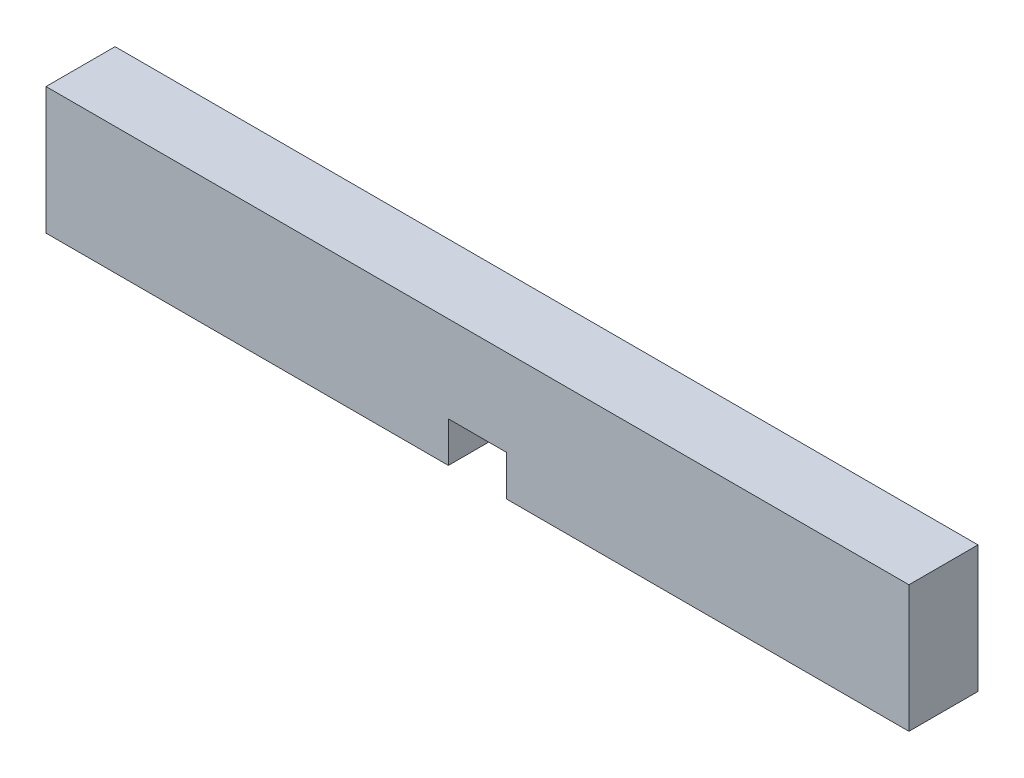
ISO-10303-21;
HEADER;
FILE_DESCRIPTION(('STEP AP214'),'2;1');
FILE_NAME('part.step','',(''),(''),'','','');
FILE_SCHEMA(('AUTOMOTIVE_DESIGN { 1 0 10303 214 1 1 1 1 }'));
ENDSEC;
DATA;
#1=APPLICATION_CONTEXT('core data for automotive mechanical design processes');
#2=APPLICATION_PROTOCOL_DEFINITION('international standard','automotive_design',2000,#1);
#3=PRODUCT_CONTEXT('',#1,'mechanical');
#4=PRODUCT('Part','Part','',(#3));
#5=PRODUCT_RELATED_PRODUCT_CATEGORY('part','',(#4));
#6=PRODUCT_DEFINITION_FORMATION('','',#4);
#7=PRODUCT_DEFINITION_CONTEXT('part definition',#1,'design');
#8=PRODUCT_DEFINITION('design','',#6,#7);
#9=PRODUCT_DEFINITION_SHAPE('','',#8);
#10=(LENGTH_UNIT() NAMED_UNIT(*) SI_UNIT(.MILLI.,.METRE.));
#11=(NAMED_UNIT(*) PLANE_ANGLE_UNIT() SI_UNIT($,.RADIAN.));
#12=(NAMED_UNIT(*) SI_UNIT($,.STERADIAN.) SOLID_ANGLE_UNIT());
#13=UNCERTAINTY_MEASURE_WITH_UNIT(LENGTH_MEASURE(1.E-05),#10,'distance_accuracy_value','');
#14=(GEOMETRIC_REPRESENTATION_CONTEXT(3) GLOBAL_UNCERTAINTY_ASSIGNED_CONTEXT((#13)) GLOBAL_UNIT_ASSIGNED_CONTEXT((#10,
#11,#12)) REPRESENTATION_CONTEXT('',''));
#15=CARTESIAN_POINT('',(0.,0.,0.));
#16=DIRECTION('',(0.,0.,1.));
#17=DIRECTION('',(1.,0.,0.));
#18=AXIS2_PLACEMENT_3D('',#15,#16,#17);
#19=CARTESIAN_POINT('',(0.,-1.57178242769157,2.35));
#20=DIRECTION('',(0.,1.,0.));
#21=DIRECTION('',(-1.,0.,0.));
#22=AXIS2_PLACEMENT_3D('',#19,#20,#21);
#23=PLANE('',#22);
#24=DIRECTION('',(1.,0.,0.));
#25=VECTOR('',#24,1.);
#26=CARTESIAN_POINT('',(0.,-1.57178242769157,-2.35));
#27=LINE('',#26,#25);
#28=CARTESIAN_POINT('',(-1.97999999999999,-1.57178242769157,-2.35));
#29=VERTEX_POINT('',#28);
#30=CARTESIAN_POINT('',(1.97999999999999,-1.57178242769157,-2.35));
#31=VERTEX_POINT('',#30);
#32=EDGE_CURVE('E131',#29,#31,#27,.T.);
#33=ORIENTED_EDGE('',*,*,#32,.T.);
#34=DIRECTION('',(0.,0.,-1.));
#35=VECTOR('',#34,1.);
#36=CARTESIAN_POINT('',(1.97999999999999,-1.57178242769157,2.35));
#37=LINE('',#36,#35);
#38=CARTESIAN_POINT('',(1.97999999999999,-1.57178242769157,2.35));
#39=VERTEX_POINT('',#38);
#40=EDGE_CURVE('E11',#39,#31,#37,.T.);
#41=ORIENTED_EDGE('',*,*,#40,.F.);
#42=DIRECTION('',(1.,0.,0.));
#43=VECTOR('',#42,1.);
#44=CARTESIAN_POINT('',(0.,-1.57178242769157,2.35));
#45=LINE('',#44,#43);
#46=CARTESIAN_POINT('',(-1.97999999999999,-1.57178242769157,2.35));
#47=VERTEX_POINT('',#46);
#48=EDGE_CURVE('E148',#47,#39,#45,.T.);
#49=ORIENTED_EDGE('',*,*,#48,.F.);
#50=DIRECTION('',(0.,0.,-1.));
#51=VECTOR('',#50,1.);
#52=CARTESIAN_POINT('',(-1.97999999999999,-1.57178242769157,2.35));
#53=LINE('',#52,#51);
#54=EDGE_CURVE('E127',#47,#29,#53,.T.);
#55=ORIENTED_EDGE('',*,*,#54,.T.);
#56=EDGE_LOOP('',(#33,#41,#49,#55));
#57=FACE_BOUND('',#56,.T.);
#58=ADVANCED_FACE('F35',(#57),#23,.F.);
#59=CARTESIAN_POINT('',(1.97999999999999,0.,2.35));
#60=DIRECTION('',(1.,0.,0.));
#61=DIRECTION('',(0.,1.,0.));
#62=AXIS2_PLACEMENT_3D('',#59,#60,#61);
#63=PLANE('',#62);
#64=DIRECTION('',(0.,-1.,0.));
#65=VECTOR('',#64,1.);
#66=CARTESIAN_POINT('',(1.97999999999999,0.,-2.35));
#67=LINE('',#66,#65);
#68=CARTESIAN_POINT('',(1.98,-4.32,-2.35));
#69=VERTEX_POINT('',#68);
#70=EDGE_CURVE('E134',#31,#69,#67,.T.);
#71=ORIENTED_EDGE('',*,*,#70,.T.);
#72=DIRECTION('',(0.,0.,-1.));
#73=VECTOR('',#72,1.);
#74=CARTESIAN_POINT('',(1.98,-4.32,2.35));
#75=LINE('',#74,#73);
#76=CARTESIAN_POINT('',(1.98,-4.32,2.35));
#77=VERTEX_POINT('',#76);
#78=EDGE_CURVE('E43',#77,#69,#75,.T.);
#79=ORIENTED_EDGE('',*,*,#78,.F.);
#80=DIRECTION('',(0.,-1.,0.));
#81=VECTOR('',#80,1.);
#82=CARTESIAN_POINT('',(1.97999999999999,0.,2.35));
#83=LINE('',#82,#81);
#84=EDGE_CURVE('E94',#39,#77,#83,.T.);
#85=ORIENTED_EDGE('',*,*,#84,.F.);
#86=ORIENTED_EDGE('',*,*,#40,.T.);
#87=EDGE_LOOP('',(#71,#79,#85,#86));
#88=FACE_BOUND('',#87,.T.);
#89=ADVANCED_FACE('F178',(#88),#63,.F.);
#90=CARTESIAN_POINT('',(0.,-4.32,2.35));
#91=DIRECTION('',(0.,1.,0.));
#92=DIRECTION('',(-1.,0.,0.));
#93=AXIS2_PLACEMENT_3D('',#90,#91,#92);
#94=PLANE('',#93);
#95=DIRECTION('',(1.,0.,0.));
#96=VECTOR('',#95,1.);
#97=CARTESIAN_POINT('',(0.,-4.32,-2.35));
#98=LINE('',#97,#96);
#99=CARTESIAN_POINT('',(29.36,-4.32,-2.35));
#100=VERTEX_POINT('',#99);
#101=EDGE_CURVE('E136',#69,#100,#98,.T.);
#102=ORIENTED_EDGE('',*,*,#101,.T.);
#103=DIRECTION('',(0.,0.,-1.));
#104=VECTOR('',#103,1.);
#105=CARTESIAN_POINT('',(29.36,-4.32,2.35));
#106=LINE('',#105,#104);
#107=CARTESIAN_POINT('',(29.36,-4.32,2.35));
#108=VERTEX_POINT('',#107);
#109=EDGE_CURVE('E154',#108,#100,#106,.T.);
#110=ORIENTED_EDGE('',*,*,#109,.F.);
#111=DIRECTION('',(1.,0.,0.));
#112=VECTOR('',#111,1.);
#113=CARTESIAN_POINT('',(0.,-4.32,2.35));
#114=LINE('',#113,#112);
#115=EDGE_CURVE('E161',#77,#108,#114,.T.);
#116=ORIENTED_EDGE('',*,*,#115,.F.);
#117=ORIENTED_EDGE('',*,*,#78,.T.);
#118=EDGE_LOOP('',(#102,#110,#116,#117));
#119=FACE_BOUND('',#118,.T.);
#120=ADVANCED_FACE('F159',(#119),#94,.F.);
#121=CARTESIAN_POINT('',(29.36,0.,2.35));
#122=DIRECTION('',(1.,0.,0.));
#123=DIRECTION('',(0.,0.,-1.));
#124=AXIS2_PLACEMENT_3D('',#121,#122,#123);
#125=PLANE('',#124);
#126=DIRECTION('',(0.,-1.,0.));
#127=VECTOR('',#126,1.);
#128=CARTESIAN_POINT('',(29.36,0.,-2.35));
#129=LINE('',#128,#127);
#130=CARTESIAN_POINT('',(29.36,4.32,-2.35));
#131=VERTEX_POINT('',#130);
#132=EDGE_CURVE('E139',#131,#100,#129,.T.);
#133=ORIENTED_EDGE('',*,*,#132,.F.);
#134=DIRECTION('',(0.,0.,-1.));
#135=VECTOR('',#134,1.);
#136=CARTESIAN_POINT('',(29.36,4.32,2.35));
#137=LINE('',#136,#135);
#138=CARTESIAN_POINT('',(29.36,4.32,2.35));
#139=VERTEX_POINT('',#138);
#140=EDGE_CURVE('E152',#139,#131,#137,.T.);
#141=ORIENTED_EDGE('',*,*,#140,.F.);
#142=DIRECTION('',(0.,-1.,0.));
#143=VECTOR('',#142,1.);
#144=CARTESIAN_POINT('',(29.36,0.,2.35));
#145=LINE('',#144,#143);
#146=EDGE_CURVE('E170',#139,#108,#145,.T.);
#147=ORIENTED_EDGE('',*,*,#146,.T.);
#148=ORIENTED_EDGE('',*,*,#109,.T.);
#149=EDGE_LOOP('',(#133,#141,#147,#148));
#150=FACE_BOUND('',#149,.T.);
#151=ADVANCED_FACE('F168',(#150),#125,.T.);
#152=CARTESIAN_POINT('',(0.,4.32,2.35));
#153=DIRECTION('',(0.,1.,0.));
#154=DIRECTION('',(0.,0.,1.));
#155=AXIS2_PLACEMENT_3D('',#152,#153,#154);
#156=PLANE('',#155);
#157=DIRECTION('',(1.,0.,0.));
#158=VECTOR('',#157,1.);
#159=CARTESIAN_POINT('',(0.,4.32,-2.35));
#160=LINE('',#159,#158);
#161=CARTESIAN_POINT('',(-29.36,4.32,-2.35));
#162=VERTEX_POINT('',#161);
#163=EDGE_CURVE('E142',#162,#131,#160,.T.);
#164=ORIENTED_EDGE('',*,*,#163,.F.);
#165=DIRECTION('',(0.,0.,-1.));
#166=VECTOR('',#165,1.);
#167=CARTESIAN_POINT('',(-29.36,4.32,2.35));
#168=LINE('',#167,#166);
#169=CARTESIAN_POINT('',(-29.36,4.32,2.35));
#170=VERTEX_POINT('',#169);
#171=EDGE_CURVE('E122',#170,#162,#168,.T.);
#172=ORIENTED_EDGE('',*,*,#171,.F.);
#173=DIRECTION('',(1.,0.,0.));
#174=VECTOR('',#173,1.);
#175=CARTESIAN_POINT('',(0.,4.32,2.35));
#176=LINE('',#175,#174);
#177=EDGE_CURVE('E115',#170,#139,#176,.T.);
#178=ORIENTED_EDGE('',*,*,#177,.T.);
#179=ORIENTED_EDGE('',*,*,#140,.T.);
#180=EDGE_LOOP('',(#164,#172,#178,#179));
#181=FACE_BOUND('',#180,.T.);
#182=ADVANCED_FACE('F188',(#181),#156,.T.);
#183=CARTESIAN_POINT('',(-29.36,0.,2.35));
#184=DIRECTION('',(1.,0.,0.));
#185=DIRECTION('',(0.,0.,-1.));
#186=AXIS2_PLACEMENT_3D('',#183,#184,#185);
#187=PLANE('',#186);
#188=DIRECTION('',(0.,-1.,0.));
#189=VECTOR('',#188,1.);
#190=CARTESIAN_POINT('',(-29.36,0.,-2.35));
#191=LINE('',#190,#189);
#192=CARTESIAN_POINT('',(-29.36,-4.32,-2.35));
#193=VERTEX_POINT('',#192);
#194=EDGE_CURVE('E121',#162,#193,#191,.T.);
#195=ORIENTED_EDGE('',*,*,#194,.T.);
#196=DIRECTION('',(0.,0.,-1.));
#197=VECTOR('',#196,1.);
#198=CARTESIAN_POINT('',(-29.36,-4.32,2.35));
#199=LINE('',#198,#197);
#200=CARTESIAN_POINT('',(-29.36,-4.32,2.35));
#201=VERTEX_POINT('',#200);
#202=EDGE_CURVE('E118',#201,#193,#199,.T.);
#203=ORIENTED_EDGE('',*,*,#202,.F.);
#204=DIRECTION('',(0.,-1.,0.));
#205=VECTOR('',#204,1.);
#206=CARTESIAN_POINT('',(-29.36,0.,2.35));
#207=LINE('',#206,#205);
#208=EDGE_CURVE('E108',#170,#201,#207,.T.);
#209=ORIENTED_EDGE('',*,*,#208,.F.);
#210=ORIENTED_EDGE('',*,*,#171,.T.);
#211=EDGE_LOOP('',(#195,#203,#209,#210));
#212=FACE_BOUND('',#211,.T.);
#213=ADVANCED_FACE('F119',(#212),#187,.F.);
#214=CARTESIAN_POINT('',(0.,-4.32,2.35));
#215=DIRECTION('',(0.,1.,0.));
#216=DIRECTION('',(0.,0.,1.));
#217=AXIS2_PLACEMENT_3D('',#214,#215,#216);
#218=PLANE('',#217);
#219=DIRECTION('',(1.,0.,0.));
#220=VECTOR('',#219,1.);
#221=CARTESIAN_POINT('',(0.,-4.32,-2.35));
#222=LINE('',#221,#220);
#223=CARTESIAN_POINT('',(-1.97999999999999,-4.32,-2.35));
#224=VERTEX_POINT('',#223);
#225=EDGE_CURVE('E80',#193,#224,#222,.T.);
#226=ORIENTED_EDGE('',*,*,#225,.T.);
#227=DIRECTION('',(0.,0.,-1.));
#228=VECTOR('',#227,1.);
#229=CARTESIAN_POINT('',(-1.97999999999999,-4.32,2.35));
#230=LINE('',#229,#228);
#231=CARTESIAN_POINT('',(-1.97999999999999,-4.32,2.35));
#232=VERTEX_POINT('',#231);
#233=EDGE_CURVE('E123',#232,#224,#230,.T.);
#234=ORIENTED_EDGE('',*,*,#233,.F.);
#235=DIRECTION('',(1.,0.,0.));
#236=VECTOR('',#235,1.);
#237=CARTESIAN_POINT('',(0.,-4.32,2.35));
#238=LINE('',#237,#236);
#239=EDGE_CURVE('E112',#201,#232,#238,.T.);
#240=ORIENTED_EDGE('',*,*,#239,.F.);
#241=ORIENTED_EDGE('',*,*,#202,.T.);
#242=EDGE_LOOP('',(#226,#234,#240,#241));
#243=FACE_BOUND('',#242,.T.);
#244=ADVANCED_FACE('F125',(#243),#218,.F.);
#245=CARTESIAN_POINT('',(-1.97999999999999,0.,2.35));
#246=DIRECTION('',(-1.,0.,0.));
#247=DIRECTION('',(0.,0.,1.));
#248=AXIS2_PLACEMENT_3D('',#245,#246,#247);
#249=PLANE('',#248);
#250=DIRECTION('',(0.,1.,0.));
#251=VECTOR('',#250,1.);
#252=CARTESIAN_POINT('',(-1.97999999999999,0.,-2.35));
#253=LINE('',#252,#251);
#254=EDGE_CURVE('E86',#224,#29,#253,.T.);
#255=ORIENTED_EDGE('',*,*,#254,.T.);
#256=ORIENTED_EDGE('',*,*,#54,.F.);
#257=DIRECTION('',(0.,1.,0.));
#258=VECTOR('',#257,1.);
#259=CARTESIAN_POINT('',(-1.97999999999999,0.,2.35));
#260=LINE('',#259,#258);
#261=EDGE_CURVE('E51',#232,#47,#260,.T.);
#262=ORIENTED_EDGE('',*,*,#261,.F.);
#263=ORIENTED_EDGE('',*,*,#233,.T.);
#264=EDGE_LOOP('',(#255,#256,#262,#263));
#265=FACE_BOUND('',#264,.T.);
#266=ADVANCED_FACE('F196',(#265),#249,.F.);
#267=CARTESIAN_POINT('',(0.,0.,2.35));
#268=DIRECTION('',(0.,0.,1.));
#269=DIRECTION('',(1.,0.,0.));
#270=AXIS2_PLACEMENT_3D('',#267,#268,#269);
#271=PLANE('',#270);
#272=ORIENTED_EDGE('',*,*,#48,.T.);
#273=ORIENTED_EDGE('',*,*,#84,.T.);
#274=ORIENTED_EDGE('',*,*,#115,.T.);
#275=ORIENTED_EDGE('',*,*,#146,.F.);
#276=ORIENTED_EDGE('',*,*,#177,.F.);
#277=ORIENTED_EDGE('',*,*,#208,.T.);
#278=ORIENTED_EDGE('',*,*,#239,.T.);
#279=ORIENTED_EDGE('',*,*,#261,.T.);
#280=EDGE_LOOP('',(#272,#273,#274,#275,#276,#277,#278,#279));
#281=FACE_BOUND('',#280,.T.);
#282=ADVANCED_FACE('F110',(#281),#271,.T.);
#283=CARTESIAN_POINT('',(0.,0.,-2.35));
#284=DIRECTION('',(0.,0.,1.));
#285=DIRECTION('',(1.,0.,0.));
#286=AXIS2_PLACEMENT_3D('',#283,#284,#285);
#287=PLANE('',#286);
#288=ORIENTED_EDGE('',*,*,#32,.F.);
#289=ORIENTED_EDGE('',*,*,#254,.F.);
#290=ORIENTED_EDGE('',*,*,#225,.F.);
#291=ORIENTED_EDGE('',*,*,#194,.F.);
#292=ORIENTED_EDGE('',*,*,#163,.T.);
#293=ORIENTED_EDGE('',*,*,#132,.T.);
#294=ORIENTED_EDGE('',*,*,#101,.F.);
#295=ORIENTED_EDGE('',*,*,#70,.F.);
#296=EDGE_LOOP('',(#288,#289,#290,#291,#292,#293,#294,#295));
#297=FACE_BOUND('',#296,.T.);
#298=ADVANCED_FACE('F164',(#297),#287,.F.);
#299=CLOSED_SHELL('',(#58,#89,#120,#151,#182,#213,#244,#266,#282,#298));
#300=MANIFOLD_SOLID_BREP('B2',#299);
#301=ADVANCED_BREP_SHAPE_REPRESENTATION('',(#18,#300),#14);
#302=SHAPE_DEFINITION_REPRESENTATION(#9,#301);
ENDSEC;
END-ISO-10303-21;
